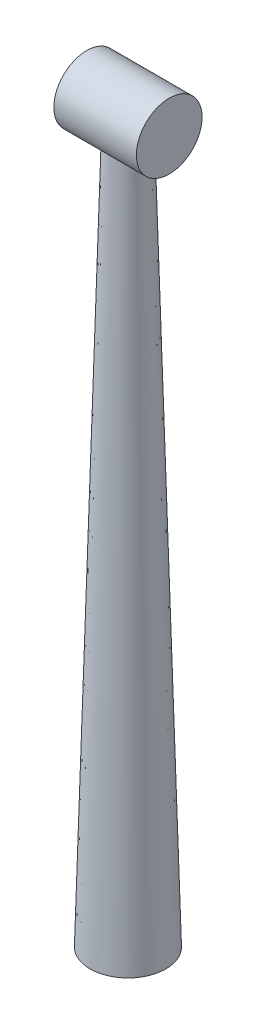
ISO-10303-21;
HEADER;
FILE_DESCRIPTION(('STEP AP214'),'2;1');
FILE_NAME('part.step','',(''),(''),'','','');
FILE_SCHEMA(('AUTOMOTIVE_DESIGN { 1 0 10303 214 1 1 1 1 }'));
ENDSEC;
DATA;
#1=APPLICATION_CONTEXT('core data for automotive mechanical design processes');
#2=APPLICATION_PROTOCOL_DEFINITION('international standard','automotive_design',2000,#1);
#3=PRODUCT_CONTEXT('',#1,'mechanical');
#4=PRODUCT('Part','Part','',(#3));
#5=PRODUCT_RELATED_PRODUCT_CATEGORY('part','',(#4));
#6=PRODUCT_DEFINITION_FORMATION('','',#4);
#7=PRODUCT_DEFINITION_CONTEXT('part definition',#1,'design');
#8=PRODUCT_DEFINITION('design','',#6,#7);
#9=PRODUCT_DEFINITION_SHAPE('','',#8);
#10=(LENGTH_UNIT() NAMED_UNIT(*) SI_UNIT(.MILLI.,.METRE.));
#11=(NAMED_UNIT(*) PLANE_ANGLE_UNIT() SI_UNIT($,.RADIAN.));
#12=(NAMED_UNIT(*) SI_UNIT($,.STERADIAN.) SOLID_ANGLE_UNIT());
#13=UNCERTAINTY_MEASURE_WITH_UNIT(LENGTH_MEASURE(1.E-05),#10,'distance_accuracy_value','');
#14=(GEOMETRIC_REPRESENTATION_CONTEXT(3) GLOBAL_UNCERTAINTY_ASSIGNED_CONTEXT((#13)) GLOBAL_UNIT_ASSIGNED_CONTEXT((#10,
#11,#12)) REPRESENTATION_CONTEXT('',''));
#15=CARTESIAN_POINT('',(0.,0.,0.));
#16=DIRECTION('',(0.,0.,1.));
#17=DIRECTION('',(1.,0.,0.));
#18=AXIS2_PLACEMENT_3D('',#15,#16,#17);
#19=CARTESIAN_POINT('',(10.,0.,0.));
#20=DIRECTION('',(-1.,0.,0.));
#21=DIRECTION('',(0.,0.,1.));
#22=AXIS2_PLACEMENT_3D('',#19,#20,#21);
#23=CYLINDRICAL_SURFACE('',#22,3.985);
#24=CARTESIAN_POINT('',(10.,0.,0.));
#25=DIRECTION('',(1.,0.,0.));
#26=DIRECTION('',(0.,0.,-1.));
#27=AXIS2_PLACEMENT_3D('',#24,#25,#26);
#28=CIRCLE('',#27,3.985);
#29=CARTESIAN_POINT('',(10.,0.,-3.985));
#30=VERTEX_POINT('',#29);
#31=EDGE_CURVE('E44',#30,#30,#28,.T.);
#32=ORIENTED_EDGE('',*,*,#31,.F.);
#33=EDGE_LOOP('',(#32));
#34=FACE_BOUND('',#33,.T.);
#35=CARTESIAN_POINT('',(0.,0.,0.));
#36=DIRECTION('',(1.,0.,0.));
#37=DIRECTION('',(0.,0.,-1.));
#38=AXIS2_PLACEMENT_3D('',#35,#36,#37);
#39=CIRCLE('',#38,3.985);
#40=CARTESIAN_POINT('',(0.,0.,-3.985));
#41=VERTEX_POINT('',#40);
#42=EDGE_CURVE('E48',#41,#41,#39,.T.);
#43=ORIENTED_EDGE('',*,*,#42,.T.);
#44=EDGE_LOOP('',(#43));
#45=FACE_BOUND('',#44,.T.);
#46=CARTESIAN_POINT('',(2.90859948758356,-3.85546333918234,-1.00778342922522));
#47=CARTESIAN_POINT('',(2.96787854662443,-3.8238217688992,-1.12882567788556));
#48=CARTESIAN_POINT('',(3.03737149957084,-3.78766927975753,-1.24370191806754));
#49=CARTESIAN_POINT('',(3.19412044773767,-3.71018261811589,-1.45872607136496));
#50=CARTESIAN_POINT('',(3.28140129784105,-3.66884122659886,-1.55885303443455));
#51=CARTESIAN_POINT('',(3.47124308050918,-3.58530459686969,-1.74239952199664));
#52=CARTESIAN_POINT('',(3.57376837152048,-3.54311154357441,-1.82585698085835));
#53=CARTESIAN_POINT('',(3.79242098120648,-3.46235862721026,-1.97470714552909));
#54=CARTESIAN_POINT('',(3.90853648099166,-3.42379565909341,-2.04011538424237));
#55=CARTESIAN_POINT('',(4.13421353606449,-3.36041850505367,-2.14263814184649));
#56=CARTESIAN_POINT('',(4.24218040249731,-3.33441242514725,-2.18251420292536));
#57=CARTESIAN_POINT('',(4.46450008418574,-3.29183997351535,-2.24621915132249));
#58=CARTESIAN_POINT('',(4.57884540188659,-3.27526276506922,-2.27006646643416));
#59=CARTESIAN_POINT('',(4.81155497462205,-3.25393394334508,-2.30054515231616));
#60=CARTESIAN_POINT('',(4.92993680203052,-3.24924328181158,-2.30708779577819));
#61=CARTESIAN_POINT('',(5.16615535915453,-3.25266776880575,-2.3022562670386));
#62=CARTESIAN_POINT('',(5.28399203457943,-3.26078416635581,-2.29088034730975));
#63=CARTESIAN_POINT('',(5.5059316684483,-3.28734326200383,-2.25256944716485));
#64=CARTESIAN_POINT('',(5.61037786596447,-3.30490496809023,-2.22695639724785));
#65=CARTESIAN_POINT('',(5.81339231088228,-3.34754705649092,-2.16232396044404));
#66=CARTESIAN_POINT('',(5.91195824686836,-3.37263037235793,-2.12329934195369));
#67=CARTESIAN_POINT('',(6.11220910952612,-3.43085210316799,-2.02803269811666));
#68=CARTESIAN_POINT('',(6.21304502741828,-3.46457299569259,-1.97036921172794));
#69=CARTESIAN_POINT('',(6.40441471508775,-3.53487399376067,-1.84127634553858));
#70=CARTESIAN_POINT('',(6.49494060035115,-3.57145625192608,-1.76983654136305));
#71=CARTESIAN_POINT('',(6.67782804156968,-3.65016314938014,-1.60200153452353));
#72=CARTESIAN_POINT('',(6.76824007696848,-3.69225480623951,-1.50344865613947));
#73=CARTESIAN_POINT('',(6.93143109785269,-3.77180479963261,-1.29095901241277));
#74=CARTESIAN_POINT('',(7.00420814657976,-3.80926262703617,-1.17702055949088));
#75=CARTESIAN_POINT('',(7.12877216044493,-3.87518606076063,-0.937252441422564));
#76=CARTESIAN_POINT('',(7.18076248781035,-3.90373815537922,-0.811553618608654));
#77=CARTESIAN_POINT('',(7.26191905848499,-3.94892493148014,-0.551011118986909));
#78=CARTESIAN_POINT('',(7.29111602486589,-3.96557565220599,-0.416180019038474));
#79=CARTESIAN_POINT('',(7.32253715704,-3.98353738950234,-0.160728421468683));
#80=CARTESIAN_POINT('',(7.32783117519276,-3.98659344714144,-0.0406017408570188));
#81=CARTESIAN_POINT('',(7.31954871214578,-3.98183698370933,0.198767723838163));
#82=CARTESIAN_POINT('',(7.30597686689989,-3.97402713274348,0.318010717834087));
#83=CARTESIAN_POINT('',(7.26218637602219,-3.94918226062964,0.544372454271192));
#84=CARTESIAN_POINT('',(7.23308123940705,-3.93276548128598,0.651779986680503));
#85=CARTESIAN_POINT('',(7.16027327662778,-3.89253641450469,0.860023652405513));
#86=CARTESIAN_POINT('',(7.11656821214626,-3.86872299312596,0.960858775269379));
#87=CARTESIAN_POINT('',(7.01241340992467,-3.81360981561555,1.16110150436051));
#88=CARTESIAN_POINT('',(6.9509836414497,-3.7818941112658,1.25988210121194));
#89=CARTESIAN_POINT('',(6.81476713286386,-3.7145951584245,1.44632348186603));
#90=CARTESIAN_POINT('',(6.7399697725119,-3.67900884368649,1.53397532873176));
#91=CARTESIAN_POINT('',(6.56780623078904,-3.60191707468752,1.70780733005582));
#92=CARTESIAN_POINT('',(6.46876367793308,-3.56025104006912,1.79226109496637));
#93=CARTESIAN_POINT('',(6.25718517400925,-3.47976292398132,1.94392725878342));
#94=CARTESIAN_POINT('',(6.14465030229092,-3.44094061542114,2.01114103549433));
#95=CARTESIAN_POINT('',(5.92265937095993,-3.37526119066992,2.11927779345036));
#96=CARTESIAN_POINT('',(5.81455751755551,-3.34751679383273,2.16242953519495));
#97=CARTESIAN_POINT('',(5.59137759969704,-3.3012109706775,2.23249015321555));
#98=CARTESIAN_POINT('',(5.47630814550086,-3.28263846002083,2.25941864419526));
#99=CARTESIAN_POINT('',(5.24139253473712,-3.25733103633627,2.29576513808184));
#100=CARTESIAN_POINT('',(5.12152248265388,-3.2506656219277,2.30508035521835));
#101=CARTESIAN_POINT('',(4.88176008662312,-3.25054951064794,2.30524520808406));
#102=CARTESIAN_POINT('',(4.76186774458961,-3.25709796933807,2.29609602378938));
#103=CARTESIAN_POINT('',(4.53722372495449,-3.28107616465034,2.2616654575936));
#104=CARTESIAN_POINT('',(4.43210301640887,-3.29743376917733,2.23796871271834));
#105=CARTESIAN_POINT('',(4.2274888982751,-3.33799727380543,2.17700069482755));
#106=CARTESIAN_POINT('',(4.12799779817662,-3.36220636787499,2.13972389671452));
#107=CARTESIAN_POINT('',(3.92681212139238,-3.41861752866334,2.04851559280781));
#108=CARTESIAN_POINT('',(3.82585181052037,-3.45136940214963,1.99331280838596));
#109=CARTESIAN_POINT('',(3.63386015835232,-3.52008929858299,1.86928522833076));
#110=CARTESIAN_POINT('',(3.54283593087529,-3.55605959268898,1.80045077093784));
#111=CARTESIAN_POINT('',(3.35797370039471,-3.63408552352479,1.63799257889058));
#112=CARTESIAN_POINT('',(3.26607990037859,-3.67618064147426,1.54215844282389));
#113=CARTESIAN_POINT('',(3.0993723102384,-3.75634759605765,1.33506661261075));
#114=CARTESIAN_POINT('',(3.02456275162695,-3.79441843468592,1.22380510827806));
#115=CARTESIAN_POINT('',(2.89444008772654,-3.8626469275756,0.987585871545443));
#116=CARTESIAN_POINT('',(2.83919016646411,-3.89277885782643,0.862585431471567));
#117=CARTESIAN_POINT('',(2.75148132656586,-3.9413604852453,0.602733977866633));
#118=CARTESIAN_POINT('',(2.71899189797199,-3.95982581796743,0.467896419694334));
#119=CARTESIAN_POINT('',(2.68154046611037,-3.98119070772724,0.211420658401651));
#120=CARTESIAN_POINT('',(2.67353115835173,-3.98581179984172,0.0903658481662229));
#121=CARTESIAN_POINT('',(2.67676231566215,-3.98395469048802,-0.151374935067348));
#122=CARTESIAN_POINT('',(2.68799487720915,-3.97748104613867,-0.272061039113965));
#123=CARTESIAN_POINT('',(2.72721018595872,-3.95517893856652,-0.498594998964927));
#124=CARTESIAN_POINT('',(2.75362019438472,-3.94023040875109,-0.604809968698153));
#125=CARTESIAN_POINT('',(2.82072735411666,-3.90296293075427,-0.811247321588953));
#126=CARTESIAN_POINT('',(2.86142983755809,-3.88064123202781,-0.911467451880413));
#127=CARTESIAN_POINT('',(2.90859948758356,-3.85546333918234,-1.00778342922522));
#128=B_SPLINE_CURVE_WITH_KNOTS('',3,(#46,#47,#48,#49,#50,#51,#52,#53,#54,#55,#56,#57,#58,#59,
#60,#61,#62,#63,#64,#65,#66,#67,#68,#69,#70,#71,#72,#73,#74,#75,#76,#77,#78,#79,#80,#81,#82,#83,
#84,#85,#86,#87,#88,#89,#90,#91,#92,#93,#94,#95,#96,#97,#98,#99,#100,#101,#102,#103,#104,#105,
#106,#107,#108,#109,#110,#111,#112,#113,#114,#115,#116,#117,#118,#119,#120,#121,#122,#123,#124,
#125,#126,#127),.UNSPECIFIED.,.T.,.F.,(4,2,2,2,2,2,2,2,2,2,2,2,2,2,2,2,2,2,2,2,2,2,2,2,2,2,2,2,
2,2,2,2,2,2,2,2,2,2,2,2,4),(0.,0.414878176569123,0.830340083287916,1.24484548318573,
1.65899304513556,2.01153096061665,2.36366287683967,2.71759683178247,3.07156530665355,
3.39712670695607,3.72281524712556,4.08431987549521,4.44609913115593,4.86476403569184,
5.28347489918593,5.69798280973825,6.111931037569,6.47084710226992,6.8296749852553,
7.16568385730086,7.50174426658213,7.86203259226432,8.22260844152034,8.63085175251158,
9.0390624268901,9.39656230479581,9.75362907586619,10.112773226251,10.4718944260892,
10.7975124293275,11.1232630597406,11.4808371468542,11.8386655857282,12.2546121712241,
12.6706616690379,13.0880431360515,13.5048640359205,13.8671085135702,14.2292042364006,
14.5592086723153,14.8893363549843),.UNSPECIFIED.);
#129=CARTESIAN_POINT('',(2.90859948758356,-3.85546333918234,-1.00778342922522));
#130=VERTEX_POINT('',#129);
#131=EDGE_CURVE('E10',#130,#130,#128,.T.);
#132=ORIENTED_EDGE('',*,*,#131,.F.);
#133=EDGE_LOOP('',(#132));
#134=FACE_BOUND('',#133,.T.);
#135=ADVANCED_FACE('F33',(#34,#45,#134),#23,.T.);
#136=CARTESIAN_POINT('',(10.,0.,0.));
#137=DIRECTION('',(1.,0.,0.));
#138=DIRECTION('',(0.,0.,-1.));
#139=AXIS2_PLACEMENT_3D('',#136,#137,#138);
#140=PLANE('',#139);
#141=ORIENTED_EDGE('',*,*,#31,.T.);
#142=EDGE_LOOP('',(#141));
#143=FACE_BOUND('',#142,.T.);
#144=ADVANCED_FACE('F68',(#143),#140,.T.);
#145=CARTESIAN_POINT('',(0.,0.,0.));
#146=DIRECTION('',(1.,0.,0.));
#147=DIRECTION('',(0.,0.,-1.));
#148=AXIS2_PLACEMENT_3D('',#145,#146,#147);
#149=PLANE('',#148);
#150=ORIENTED_EDGE('',*,*,#42,.F.);
#151=EDGE_LOOP('',(#150));
#152=FACE_BOUND('',#151,.T.);
#153=ADVANCED_FACE('F66',(#152),#149,.F.);
#154=CARTESIAN_POINT('',(5.00000000000001,-87.6,0.));
#155=DIRECTION('',(0.,-1.,0.));
#156=DIRECTION('',(1.,0.,0.));
#157=AXIS2_PLACEMENT_3D('',#154,#155,#156);
#158=CONICAL_SURFACE('',#157,4.59001443461098,0.0270813150796056);
#159=CARTESIAN_POINT('',(5.00000000000001,-87.6,0.));
#160=DIRECTION('',(0.,1.,0.));
#161=DIRECTION('',(-1.,0.,0.));
#162=AXIS2_PLACEMENT_3D('',#159,#160,#161);
#163=CIRCLE('',#162,4.59001443461098);
#164=CARTESIAN_POINT('',(0.409985565389027,-87.6,0.));
#165=VERTEX_POINT('',#164);
#166=EDGE_CURVE('E53',#165,#165,#163,.T.);
#167=ORIENTED_EDGE('',*,*,#166,.T.);
#168=EDGE_LOOP('',(#167));
#169=FACE_BOUND('',#168,.T.);
#170=ORIENTED_EDGE('',*,*,#131,.T.);
#171=EDGE_LOOP('',(#170));
#172=FACE_BOUND('',#171,.T.);
#173=ADVANCED_FACE('F58',(#169,#172),#158,.T.);
#174=CARTESIAN_POINT('',(9.59001443461099,-87.6,0.));
#175=DIRECTION('',(0.,1.,0.));
#176=DIRECTION('',(-1.,0.,0.));
#177=AXIS2_PLACEMENT_3D('',#174,#175,#176);
#178=PLANE('',#177);
#179=ORIENTED_EDGE('',*,*,#166,.F.);
#180=EDGE_LOOP('',(#179));
#181=FACE_BOUND('',#180,.T.);
#182=ADVANCED_FACE('F60',(#181),#178,.F.);
#183=CLOSED_SHELL('',(#135,#144,#153,#173,#182));
#184=MANIFOLD_SOLID_BREP('B2',#183);
#185=ADVANCED_BREP_SHAPE_REPRESENTATION('',(#18,#184),#14);
#186=SHAPE_DEFINITION_REPRESENTATION(#9,#185);
ENDSEC;
END-ISO-10303-21;
